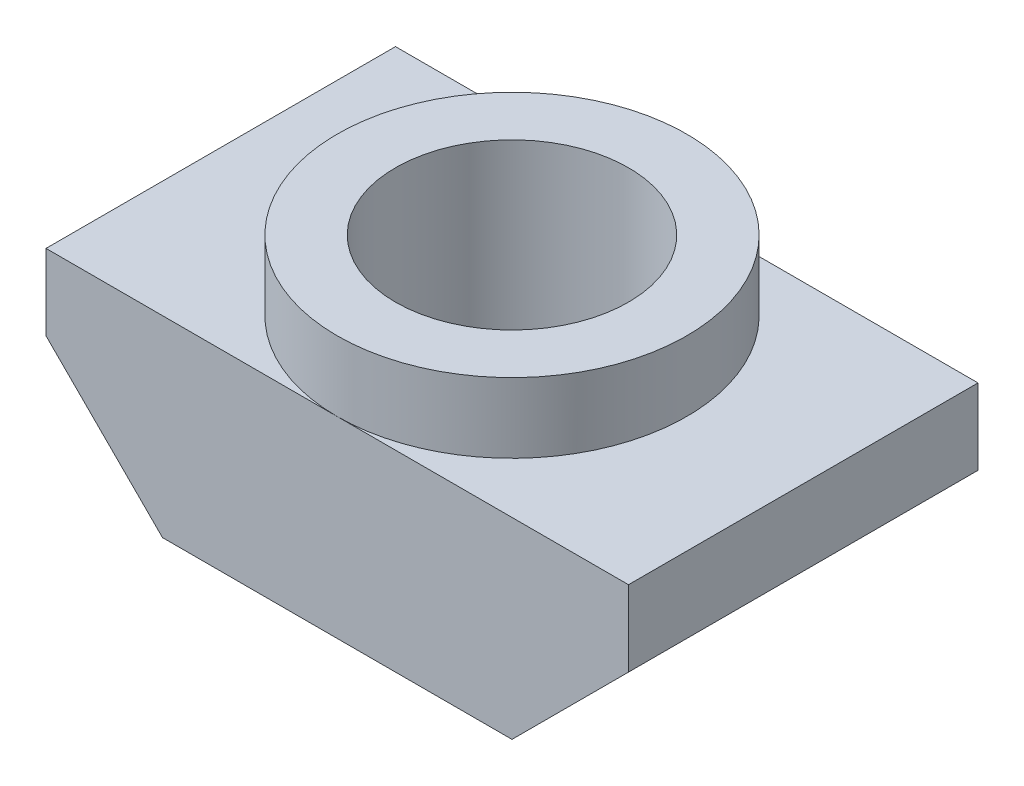
ISO-10303-21;
HEADER;
FILE_DESCRIPTION(('STEP AP214'),'2;1');
FILE_NAME('part.step','',(''),(''),'','','');
FILE_SCHEMA(('AUTOMOTIVE_DESIGN { 1 0 10303 214 1 1 1 1 }'));
ENDSEC;
DATA;
#1=APPLICATION_CONTEXT('core data for automotive mechanical design processes');
#2=APPLICATION_PROTOCOL_DEFINITION('international standard','automotive_design',2000,#1);
#3=PRODUCT_CONTEXT('',#1,'mechanical');
#4=PRODUCT('Part','Part','',(#3));
#5=PRODUCT_RELATED_PRODUCT_CATEGORY('part','',(#4));
#6=PRODUCT_DEFINITION_FORMATION('','',#4);
#7=PRODUCT_DEFINITION_CONTEXT('part definition',#1,'design');
#8=PRODUCT_DEFINITION('design','',#6,#7);
#9=PRODUCT_DEFINITION_SHAPE('','',#8);
#10=(LENGTH_UNIT() NAMED_UNIT(*) SI_UNIT(.MILLI.,.METRE.));
#11=(NAMED_UNIT(*) PLANE_ANGLE_UNIT() SI_UNIT($,.RADIAN.));
#12=(NAMED_UNIT(*) SI_UNIT($,.STERADIAN.) SOLID_ANGLE_UNIT());
#13=UNCERTAINTY_MEASURE_WITH_UNIT(LENGTH_MEASURE(1.E-05),#10,'distance_accuracy_value','');
#14=(GEOMETRIC_REPRESENTATION_CONTEXT(3) GLOBAL_UNCERTAINTY_ASSIGNED_CONTEXT((#13)) GLOBAL_UNIT_ASSIGNED_CONTEXT((#10,
#11,#12)) REPRESENTATION_CONTEXT('',''));
#15=CARTESIAN_POINT('',(0.,0.,0.));
#16=DIRECTION('',(0.,0.,1.));
#17=DIRECTION('',(1.,0.,0.));
#18=AXIS2_PLACEMENT_3D('',#15,#16,#17);
#19=CARTESIAN_POINT('',(0.,0.,0.));
#20=DIRECTION('',(0.,-1.,0.));
#21=DIRECTION('',(0.,0.,-1.));
#22=AXIS2_PLACEMENT_3D('',#19,#20,#21);
#23=PLANE('',#22);
#24=CARTESIAN_POINT('',(0.,0.,0.));
#25=DIRECTION('',(0.,1.,0.));
#26=DIRECTION('',(0.,0.,1.));
#27=AXIS2_PLACEMENT_3D('',#24,#25,#26);
#28=CIRCLE('',#27,3.);
#29=CARTESIAN_POINT('',(0.,0.,3.));
#30=VERTEX_POINT('',#29);
#31=CARTESIAN_POINT('',(0.,0.,-3.));
#32=VERTEX_POINT('',#31);
#33=EDGE_CURVE('E119',#30,#32,#28,.T.);
#34=ORIENTED_EDGE('',*,*,#33,.F.);
#35=DIRECTION('',(1.,0.,0.));
#36=VECTOR('',#35,1.);
#37=CARTESIAN_POINT('',(-5.,0.,3.));
#38=LINE('',#37,#36);
#39=CARTESIAN_POINT('',(5.,0.,3.));
#40=VERTEX_POINT('',#39);
#41=EDGE_CURVE('E107',#30,#40,#38,.T.);
#42=ORIENTED_EDGE('',*,*,#41,.T.);
#43=DIRECTION('',(0.,0.,-1.));
#44=VECTOR('',#43,1.);
#45=CARTESIAN_POINT('',(5.,0.,3.));
#46=LINE('',#45,#44);
#47=CARTESIAN_POINT('',(5.,0.,-3.));
#48=VERTEX_POINT('',#47);
#49=EDGE_CURVE('E141',#40,#48,#46,.T.);
#50=ORIENTED_EDGE('',*,*,#49,.T.);
#51=DIRECTION('',(-1.,0.,0.));
#52=VECTOR('',#51,1.);
#53=CARTESIAN_POINT('',(-5.,0.,-3.));
#54=LINE('',#53,#52);
#55=EDGE_CURVE('E121',#48,#32,#54,.T.);
#56=ORIENTED_EDGE('',*,*,#55,.T.);
#57=EDGE_LOOP('',(#34,#42,#50,#56));
#58=FACE_BOUND('',#57,.T.);
#59=ADVANCED_FACE('F34',(#58),#23,.F.);
#60=CARTESIAN_POINT('',(5.,-3.3,3.));
#61=DIRECTION('',(1.,0.,0.));
#62=DIRECTION('',(0.,0.,-1.));
#63=AXIS2_PLACEMENT_3D('',#60,#61,#62);
#64=PLANE('',#63);
#65=DIRECTION('',(0.,1.,0.));
#66=VECTOR('',#65,1.);
#67=CARTESIAN_POINT('',(5.,-3.3,3.));
#68=LINE('',#67,#66);
#69=CARTESIAN_POINT('',(5.,-1.3,3.));
#70=VERTEX_POINT('',#69);
#71=EDGE_CURVE('E113',#70,#40,#68,.T.);
#72=ORIENTED_EDGE('',*,*,#71,.F.);
#73=DIRECTION('',(0.,0.,-1.));
#74=VECTOR('',#73,1.);
#75=CARTESIAN_POINT('',(5.,-1.3,3.));
#76=LINE('',#75,#74);
#77=CARTESIAN_POINT('',(5.,-1.3,-3.));
#78=VERTEX_POINT('',#77);
#79=EDGE_CURVE('E127',#70,#78,#76,.T.);
#80=ORIENTED_EDGE('',*,*,#79,.T.);
#81=DIRECTION('',(0.,1.,0.));
#82=VECTOR('',#81,1.);
#83=CARTESIAN_POINT('',(5.,-3.3,-3.));
#84=LINE('',#83,#82);
#85=EDGE_CURVE('E140',#78,#48,#84,.T.);
#86=ORIENTED_EDGE('',*,*,#85,.T.);
#87=ORIENTED_EDGE('',*,*,#49,.F.);
#88=EDGE_LOOP('',(#72,#80,#86,#87));
#89=FACE_BOUND('',#88,.T.);
#90=ADVANCED_FACE('F163',(#89),#64,.T.);
#91=CARTESIAN_POINT('',(-5.,-3.3,3.));
#92=DIRECTION('',(0.,0.,1.));
#93=DIRECTION('',(1.,0.,0.));
#94=AXIS2_PLACEMENT_3D('',#91,#92,#93);
#95=PLANE('',#94);
#96=DIRECTION('',(1.,0.,0.));
#97=VECTOR('',#96,1.);
#98=CARTESIAN_POINT('',(-5.,-3.3,3.));
#99=LINE('',#98,#97);
#100=CARTESIAN_POINT('',(-2.99999999999999,-3.3,3.));
#101=VERTEX_POINT('',#100);
#102=CARTESIAN_POINT('',(3.,-3.3,3.));
#103=VERTEX_POINT('',#102);
#104=EDGE_CURVE('E138',#101,#103,#99,.T.);
#105=ORIENTED_EDGE('',*,*,#104,.T.);
#106=DIRECTION('',(-0.707106781186549,-0.707106781186546,0.));
#107=VECTOR('',#106,1.);
#108=CARTESIAN_POINT('',(-1.00000000000002,-7.3,3.));
#109=LINE('',#108,#107);
#110=EDGE_CURVE('E42',#103,#70,#109,.F.);
#111=ORIENTED_EDGE('',*,*,#110,.T.);
#112=ORIENTED_EDGE('',*,*,#71,.T.);
#113=ORIENTED_EDGE('',*,*,#41,.F.);
#114=CARTESIAN_POINT('',(-5.,0.,3.));
#115=VERTEX_POINT('',#114);
#116=EDGE_CURVE('E95',#115,#30,#38,.T.);
#117=ORIENTED_EDGE('',*,*,#116,.F.);
#118=DIRECTION('',(0.,1.,0.));
#119=VECTOR('',#118,1.);
#120=CARTESIAN_POINT('',(-5.,-3.3,3.));
#121=LINE('',#120,#119);
#122=CARTESIAN_POINT('',(-5.,-1.3,3.));
#123=VERTEX_POINT('',#122);
#124=EDGE_CURVE('E131',#123,#115,#121,.T.);
#125=ORIENTED_EDGE('',*,*,#124,.F.);
#126=DIRECTION('',(-0.707106781186549,0.707106781186546,0.));
#127=VECTOR('',#126,1.);
#128=CARTESIAN_POINT('',(-4.,-2.3,3.));
#129=LINE('',#128,#127);
#130=EDGE_CURVE('E49',#123,#101,#129,.F.);
#131=ORIENTED_EDGE('',*,*,#130,.T.);
#132=EDGE_LOOP('',(#105,#111,#112,#113,#117,#125,#131));
#133=FACE_BOUND('',#132,.T.);
#134=ADVANCED_FACE('F111',(#133),#95,.T.);
#135=CARTESIAN_POINT('',(-5.,-3.3,3.));
#136=DIRECTION('',(-1.,0.,0.));
#137=DIRECTION('',(0.,0.,1.));
#138=AXIS2_PLACEMENT_3D('',#135,#136,#137);
#139=PLANE('',#138);
#140=DIRECTION('',(0.,1.,0.));
#141=VECTOR('',#140,1.);
#142=CARTESIAN_POINT('',(-5.,-3.3,-3.));
#143=LINE('',#142,#141);
#144=CARTESIAN_POINT('',(-5.,-1.3,-3.));
#145=VERTEX_POINT('',#144);
#146=CARTESIAN_POINT('',(-5.,0.,-3.));
#147=VERTEX_POINT('',#146);
#148=EDGE_CURVE('E147',#145,#147,#143,.T.);
#149=ORIENTED_EDGE('',*,*,#148,.F.);
#150=DIRECTION('',(0.,0.,1.));
#151=VECTOR('',#150,1.);
#152=CARTESIAN_POINT('',(-5.,-1.3,3.));
#153=LINE('',#152,#151);
#154=EDGE_CURVE('E11',#145,#123,#153,.T.);
#155=ORIENTED_EDGE('',*,*,#154,.T.);
#156=ORIENTED_EDGE('',*,*,#124,.T.);
#157=DIRECTION('',(0.,0.,1.));
#158=VECTOR('',#157,1.);
#159=CARTESIAN_POINT('',(-5.,0.,3.));
#160=LINE('',#159,#158);
#161=EDGE_CURVE('E103',#147,#115,#160,.T.);
#162=ORIENTED_EDGE('',*,*,#161,.F.);
#163=EDGE_LOOP('',(#149,#155,#156,#162));
#164=FACE_BOUND('',#163,.T.);
#165=ADVANCED_FACE('F172',(#164),#139,.T.);
#166=CARTESIAN_POINT('',(-5.,-3.3,-3.));
#167=DIRECTION('',(0.,0.,-1.));
#168=DIRECTION('',(-1.,0.,0.));
#169=AXIS2_PLACEMENT_3D('',#166,#167,#168);
#170=PLANE('',#169);
#171=ORIENTED_EDGE('',*,*,#85,.F.);
#172=DIRECTION('',(0.707106781186549,0.707106781186546,0.));
#173=VECTOR('',#172,1.);
#174=CARTESIAN_POINT('',(-1.00000000000002,-7.3,-3.));
#175=LINE('',#174,#173);
#176=CARTESIAN_POINT('',(3.,-3.3,-3.));
#177=VERTEX_POINT('',#176);
#178=EDGE_CURVE('E154',#78,#177,#175,.F.);
#179=ORIENTED_EDGE('',*,*,#178,.T.);
#180=DIRECTION('',(-1.,0.,0.));
#181=VECTOR('',#180,1.);
#182=CARTESIAN_POINT('',(-5.,-3.3,-3.));
#183=LINE('',#182,#181);
#184=CARTESIAN_POINT('',(-2.99999999999999,-3.3,-3.));
#185=VERTEX_POINT('',#184);
#186=EDGE_CURVE('E106',#177,#185,#183,.T.);
#187=ORIENTED_EDGE('',*,*,#186,.T.);
#188=DIRECTION('',(0.707106781186549,-0.707106781186546,0.));
#189=VECTOR('',#188,1.);
#190=CARTESIAN_POINT('',(-4.,-2.3,-3.));
#191=LINE('',#190,#189);
#192=EDGE_CURVE('E129',#185,#145,#191,.F.);
#193=ORIENTED_EDGE('',*,*,#192,.T.);
#194=ORIENTED_EDGE('',*,*,#148,.T.);
#195=EDGE_CURVE('E143',#32,#147,#54,.T.);
#196=ORIENTED_EDGE('',*,*,#195,.F.);
#197=ORIENTED_EDGE('',*,*,#55,.F.);
#198=EDGE_LOOP('',(#171,#179,#187,#193,#194,#196,#197));
#199=FACE_BOUND('',#198,.T.);
#200=ADVANCED_FACE('F167',(#199),#170,.T.);
#201=CARTESIAN_POINT('',(0.,-3.3,0.));
#202=DIRECTION('',(0.,-1.,0.));
#203=DIRECTION('',(0.,0.,-1.));
#204=AXIS2_PLACEMENT_3D('',#201,#202,#203);
#205=PLANE('',#204);
#206=CARTESIAN_POINT('',(0.,-3.3,0.));
#207=DIRECTION('',(0.,1.,0.));
#208=DIRECTION('',(0.,0.,1.));
#209=AXIS2_PLACEMENT_3D('',#206,#207,#208);
#210=CIRCLE('',#209,2.);
#211=CARTESIAN_POINT('',(0.,-3.3,2.));
#212=VERTEX_POINT('',#211);
#213=EDGE_CURVE('E151',#212,#212,#210,.T.);
#214=ORIENTED_EDGE('',*,*,#213,.T.);
#215=EDGE_LOOP('',(#214));
#216=FACE_BOUND('',#215,.T.);
#217=ORIENTED_EDGE('',*,*,#186,.F.);
#218=DIRECTION('',(0.,0.,1.));
#219=VECTOR('',#218,1.);
#220=CARTESIAN_POINT('',(3.,-3.3,0.));
#221=LINE('',#220,#219);
#222=EDGE_CURVE('E56',#177,#103,#221,.T.);
#223=ORIENTED_EDGE('',*,*,#222,.T.);
#224=ORIENTED_EDGE('',*,*,#104,.F.);
#225=DIRECTION('',(0.,0.,-1.));
#226=VECTOR('',#225,1.);
#227=CARTESIAN_POINT('',(-2.99999999999999,-3.3,0.));
#228=LINE('',#227,#226);
#229=EDGE_CURVE('E156',#101,#185,#228,.T.);
#230=ORIENTED_EDGE('',*,*,#229,.T.);
#231=EDGE_LOOP('',(#217,#223,#224,#230));
#232=FACE_BOUND('',#231,.T.);
#233=ADVANCED_FACE('F169',(#216,#232),#205,.T.);
#234=EDGE_CURVE('E100',#32,#30,#28,.T.);
#235=ORIENTED_EDGE('',*,*,#234,.F.);
#236=ORIENTED_EDGE('',*,*,#195,.T.);
#237=ORIENTED_EDGE('',*,*,#161,.T.);
#238=ORIENTED_EDGE('',*,*,#116,.T.);
#239=EDGE_LOOP('',(#235,#236,#237,#238));
#240=FACE_BOUND('',#239,.T.);
#241=ADVANCED_FACE('F97',(#240),#23,.F.);
#242=CARTESIAN_POINT('',(0.,1.2,0.));
#243=DIRECTION('',(0.,-1.,0.));
#244=DIRECTION('',(0.,0.,-1.));
#245=AXIS2_PLACEMENT_3D('',#242,#243,#244);
#246=CYLINDRICAL_SURFACE('',#245,3.);
#247=CARTESIAN_POINT('',(0.,1.2,0.));
#248=DIRECTION('',(0.,1.,0.));
#249=DIRECTION('',(0.,0.,1.));
#250=AXIS2_PLACEMENT_3D('',#247,#248,#249);
#251=CIRCLE('',#250,3.);
#252=CARTESIAN_POINT('',(0.,1.2,3.));
#253=VERTEX_POINT('',#252);
#254=EDGE_CURVE('E123',#253,#253,#251,.T.);
#255=ORIENTED_EDGE('',*,*,#254,.F.);
#256=EDGE_LOOP('',(#255));
#257=FACE_BOUND('',#256,.T.);
#258=ORIENTED_EDGE('',*,*,#33,.T.);
#259=ORIENTED_EDGE('',*,*,#234,.T.);
#260=EDGE_LOOP('',(#258,#259));
#261=FACE_BOUND('',#260,.T.);
#262=ADVANCED_FACE('F126',(#257,#261),#246,.T.);
#263=CARTESIAN_POINT('',(0.,1.2,0.));
#264=DIRECTION('',(0.,1.,0.));
#265=DIRECTION('',(0.,0.,1.));
#266=AXIS2_PLACEMENT_3D('',#263,#264,#265);
#267=PLANE('',#266);
#268=CARTESIAN_POINT('',(0.,1.2,0.));
#269=DIRECTION('',(0.,1.,0.));
#270=DIRECTION('',(0.,0.,1.));
#271=AXIS2_PLACEMENT_3D('',#268,#269,#270);
#272=CIRCLE('',#271,2.);
#273=CARTESIAN_POINT('',(0.,1.2,2.));
#274=VERTEX_POINT('',#273);
#275=EDGE_CURVE('E124',#274,#274,#272,.T.);
#276=ORIENTED_EDGE('',*,*,#275,.F.);
#277=EDGE_LOOP('',(#276));
#278=FACE_BOUND('',#277,.T.);
#279=ORIENTED_EDGE('',*,*,#254,.T.);
#280=EDGE_LOOP('',(#279));
#281=FACE_BOUND('',#280,.T.);
#282=ADVANCED_FACE('F193',(#278,#281),#267,.T.);
#283=CARTESIAN_POINT('',(0.,-3.3,0.));
#284=DIRECTION('',(0.,1.,0.));
#285=DIRECTION('',(0.,0.,1.));
#286=AXIS2_PLACEMENT_3D('',#283,#284,#285);
#287=CYLINDRICAL_SURFACE('',#286,2.);
#288=ORIENTED_EDGE('',*,*,#275,.T.);
#289=EDGE_LOOP('',(#288));
#290=FACE_BOUND('',#289,.T.);
#291=ORIENTED_EDGE('',*,*,#213,.F.);
#292=EDGE_LOOP('',(#291));
#293=FACE_BOUND('',#292,.T.);
#294=ADVANCED_FACE('F203',(#290,#293),#287,.F.);
#295=CARTESIAN_POINT('',(5.,-1.3,3.));
#296=DIRECTION('',(-0.707106781186546,0.707106781186549,0.));
#297=DIRECTION('',(0.,0.,-1.));
#298=AXIS2_PLACEMENT_3D('',#295,#296,#297);
#299=PLANE('',#298);
#300=ORIENTED_EDGE('',*,*,#110,.F.);
#301=ORIENTED_EDGE('',*,*,#222,.F.);
#302=ORIENTED_EDGE('',*,*,#178,.F.);
#303=ORIENTED_EDGE('',*,*,#79,.F.);
#304=EDGE_LOOP('',(#300,#301,#302,#303));
#305=FACE_BOUND('',#304,.T.);
#306=ADVANCED_FACE('F165',(#305),#299,.F.);
#307=CARTESIAN_POINT('',(-5.,-1.3,3.));
#308=DIRECTION('',(0.707106781186546,0.707106781186549,0.));
#309=DIRECTION('',(0.,0.,1.));
#310=AXIS2_PLACEMENT_3D('',#307,#308,#309);
#311=PLANE('',#310);
#312=ORIENTED_EDGE('',*,*,#192,.F.);
#313=ORIENTED_EDGE('',*,*,#229,.F.);
#314=ORIENTED_EDGE('',*,*,#130,.F.);
#315=ORIENTED_EDGE('',*,*,#154,.F.);
#316=EDGE_LOOP('',(#312,#313,#314,#315));
#317=FACE_BOUND('',#316,.T.);
#318=ADVANCED_FACE('F36',(#317),#311,.F.);
#319=CLOSED_SHELL('',(#59,#90,#134,#165,#200,#233,#241,#262,#282,#294,#306,#318));
#320=MANIFOLD_SOLID_BREP('B2',#319);
#321=ADVANCED_BREP_SHAPE_REPRESENTATION('',(#18,#320),#14);
#322=SHAPE_DEFINITION_REPRESENTATION(#9,#321);
ENDSEC;
END-ISO-10303-21;
